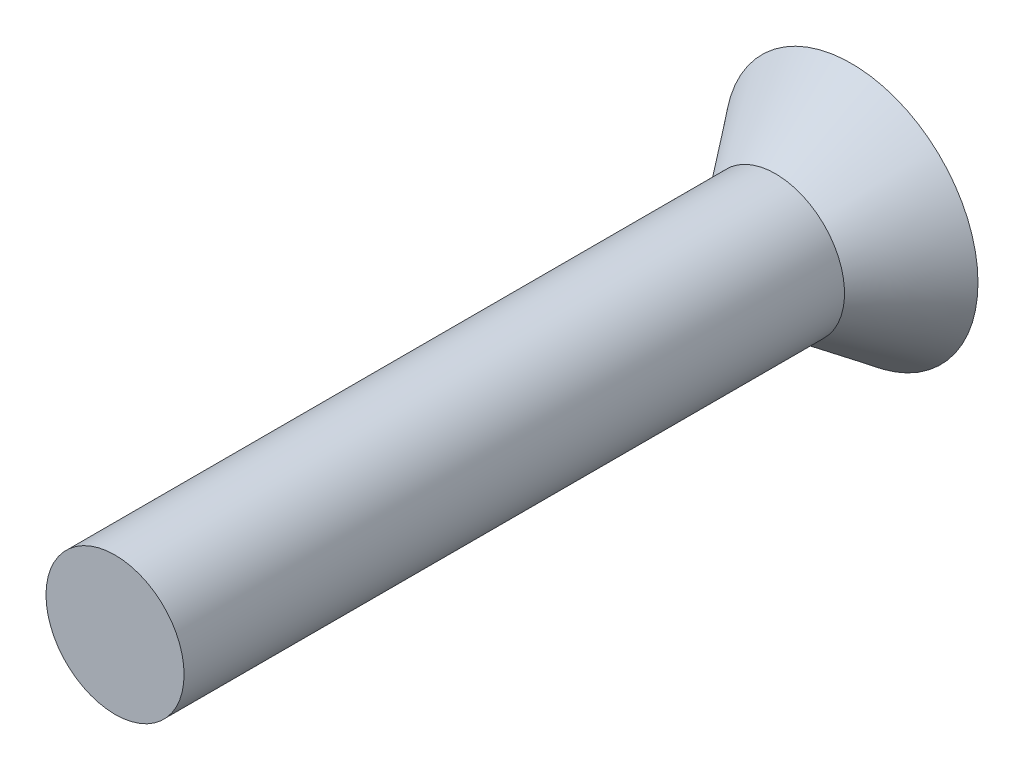
ISO-10303-21;
HEADER;
FILE_DESCRIPTION(('STEP AP214'),'2;1');
FILE_NAME('part.step','',(''),(''),'','','');
FILE_SCHEMA(('AUTOMOTIVE_DESIGN { 1 0 10303 214 1 1 1 1 }'));
ENDSEC;
DATA;
#1=APPLICATION_CONTEXT('core data for automotive mechanical design processes');
#2=APPLICATION_PROTOCOL_DEFINITION('international standard','automotive_design',2000,#1);
#3=PRODUCT_CONTEXT('',#1,'mechanical');
#4=PRODUCT('Part','Part','',(#3));
#5=PRODUCT_RELATED_PRODUCT_CATEGORY('part','',(#4));
#6=PRODUCT_DEFINITION_FORMATION('','',#4);
#7=PRODUCT_DEFINITION_CONTEXT('part definition',#1,'design');
#8=PRODUCT_DEFINITION('design','',#6,#7);
#9=PRODUCT_DEFINITION_SHAPE('','',#8);
#10=(LENGTH_UNIT() NAMED_UNIT(*) SI_UNIT(.MILLI.,.METRE.));
#11=(NAMED_UNIT(*) PLANE_ANGLE_UNIT() SI_UNIT($,.RADIAN.));
#12=(NAMED_UNIT(*) SI_UNIT($,.STERADIAN.) SOLID_ANGLE_UNIT());
#13=UNCERTAINTY_MEASURE_WITH_UNIT(LENGTH_MEASURE(1.E-05),#10,'distance_accuracy_value','');
#14=(GEOMETRIC_REPRESENTATION_CONTEXT(3) GLOBAL_UNCERTAINTY_ASSIGNED_CONTEXT((#13)) GLOBAL_UNIT_ASSIGNED_CONTEXT((#10,
#11,#12)) REPRESENTATION_CONTEXT('',''));
#15=CARTESIAN_POINT('',(0.,0.,0.));
#16=DIRECTION('',(0.,0.,1.));
#17=DIRECTION('',(1.,0.,0.));
#18=AXIS2_PLACEMENT_3D('',#15,#16,#17);
#19=CARTESIAN_POINT('',(0.,0.,16.));
#20=DIRECTION('',(0.,0.,-1.));
#21=DIRECTION('',(-1.,0.,0.));
#22=AXIS2_PLACEMENT_3D('',#19,#20,#21);
#23=CYLINDRICAL_SURFACE('',#22,1.5);
#24=CARTESIAN_POINT('',(0.,0.,16.));
#25=DIRECTION('',(0.,0.,1.));
#26=DIRECTION('',(1.,0.,0.));
#27=AXIS2_PLACEMENT_3D('',#24,#25,#26);
#28=CIRCLE('',#27,1.5);
#29=CARTESIAN_POINT('',(1.5,0.,16.));
#30=VERTEX_POINT('',#29);
#31=EDGE_CURVE('E44',#30,#30,#28,.T.);
#32=ORIENTED_EDGE('',*,*,#31,.F.);
#33=EDGE_LOOP('',(#32));
#34=FACE_BOUND('',#33,.T.);
#35=CARTESIAN_POINT('',(0.,0.,1.65));
#36=DIRECTION('',(0.,0.,-1.));
#37=DIRECTION('',(-1.,0.,0.));
#38=AXIS2_PLACEMENT_3D('',#35,#36,#37);
#39=CIRCLE('',#38,1.5);
#40=CARTESIAN_POINT('',(-1.5,0.,1.65));
#41=VERTEX_POINT('',#40);
#42=EDGE_CURVE('E10',#41,#41,#39,.T.);
#43=ORIENTED_EDGE('',*,*,#42,.F.);
#44=EDGE_LOOP('',(#43));
#45=FACE_BOUND('',#44,.T.);
#46=ADVANCED_FACE('F37',(#34,#45),#23,.T.);
#47=CARTESIAN_POINT('',(0.,0.,16.));
#48=DIRECTION('',(0.,0.,1.));
#49=DIRECTION('',(1.,0.,0.));
#50=AXIS2_PLACEMENT_3D('',#47,#48,#49);
#51=PLANE('',#50);
#52=ORIENTED_EDGE('',*,*,#31,.T.);
#53=EDGE_LOOP('',(#52));
#54=FACE_BOUND('',#53,.T.);
#55=ADVANCED_FACE('F61',(#54),#51,.T.);
#56=CARTESIAN_POINT('',(0.,0.,1.65));
#57=DIRECTION('',(0.,0.,-1.));
#58=DIRECTION('',(-1.,0.,0.));
#59=AXIS2_PLACEMENT_3D('',#56,#57,#58);
#60=CONICAL_SURFACE('',#59,1.5,0.648331989087261);
#61=CARTESIAN_POINT('',(0.,0.,0.));
#62=DIRECTION('',(0.,0.,-1.));
#63=DIRECTION('',(-1.,0.,0.));
#64=AXIS2_PLACEMENT_3D('',#61,#62,#63);
#65=CIRCLE('',#64,2.75);
#66=CARTESIAN_POINT('',(-2.75,0.,0.));
#67=VERTEX_POINT('',#66);
#68=EDGE_CURVE('E49',#67,#67,#65,.T.);
#69=ORIENTED_EDGE('',*,*,#68,.F.);
#70=EDGE_LOOP('',(#69));
#71=FACE_BOUND('',#70,.T.);
#72=ORIENTED_EDGE('',*,*,#42,.T.);
#73=EDGE_LOOP('',(#72));
#74=FACE_BOUND('',#73,.T.);
#75=ADVANCED_FACE('F59',(#71,#74),#60,.T.);
#76=CARTESIAN_POINT('',(0.,0.,0.));
#77=DIRECTION('',(0.,0.,1.));
#78=DIRECTION('',(1.,0.,0.));
#79=AXIS2_PLACEMENT_3D('',#76,#77,#78);
#80=PLANE('',#79);
#81=ORIENTED_EDGE('',*,*,#68,.T.);
#82=EDGE_LOOP('',(#81));
#83=FACE_BOUND('',#82,.T.);
#84=ADVANCED_FACE('F57',(#83),#80,.F.);
#85=CLOSED_SHELL('',(#46,#55,#75,#84));
#86=MANIFOLD_SOLID_BREP('B2',#85);
#87=ADVANCED_BREP_SHAPE_REPRESENTATION('',(#18,#86),#14);
#88=SHAPE_DEFINITION_REPRESENTATION(#9,#87);
ENDSEC;
END-ISO-10303-21;
